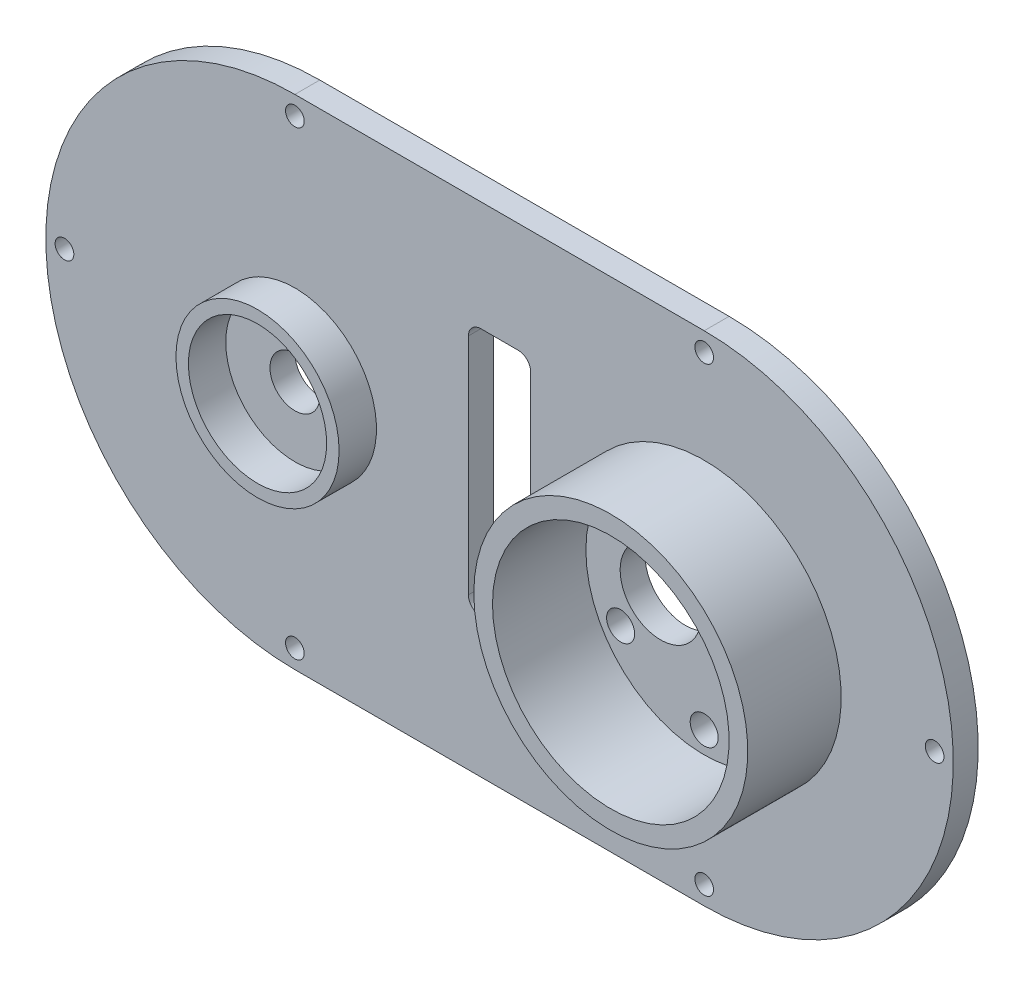
ISO-10303-21;
HEADER;
FILE_DESCRIPTION(('STEP AP214'),'2;1');
FILE_NAME('part.step','',(''),(''),'','','');
FILE_SCHEMA(('AUTOMOTIVE_DESIGN { 1 0 10303 214 1 1 1 1 }'));
ENDSEC;
DATA;
#1=APPLICATION_CONTEXT('core data for automotive mechanical design processes');
#2=APPLICATION_PROTOCOL_DEFINITION('international standard','automotive_design',2000,#1);
#3=PRODUCT_CONTEXT('',#1,'mechanical');
#4=PRODUCT('Part','Part','',(#3));
#5=PRODUCT_RELATED_PRODUCT_CATEGORY('part','',(#4));
#6=PRODUCT_DEFINITION_FORMATION('','',#4);
#7=PRODUCT_DEFINITION_CONTEXT('part definition',#1,'design');
#8=PRODUCT_DEFINITION('design','',#6,#7);
#9=PRODUCT_DEFINITION_SHAPE('','',#8);
#10=(LENGTH_UNIT() NAMED_UNIT(*) SI_UNIT(.MILLI.,.METRE.));
#11=(NAMED_UNIT(*) PLANE_ANGLE_UNIT() SI_UNIT($,.RADIAN.));
#12=(NAMED_UNIT(*) SI_UNIT($,.STERADIAN.) SOLID_ANGLE_UNIT());
#13=UNCERTAINTY_MEASURE_WITH_UNIT(LENGTH_MEASURE(1.E-05),#10,'distance_accuracy_value','');
#14=(GEOMETRIC_REPRESENTATION_CONTEXT(3) GLOBAL_UNCERTAINTY_ASSIGNED_CONTEXT((#13)) GLOBAL_UNIT_ASSIGNED_CONTEXT((#10,
#11,#12)) REPRESENTATION_CONTEXT('',''));
#15=CARTESIAN_POINT('',(0.,0.,0.));
#16=DIRECTION('',(0.,0.,1.));
#17=DIRECTION('',(1.,0.,0.));
#18=AXIS2_PLACEMENT_3D('',#15,#16,#17);
#19=CARTESIAN_POINT('',(-14.334769335642,-2.34767299496333,4.));
#20=DIRECTION('',(0.,0.,-1.));
#21=DIRECTION('',(-1.,0.,0.));
#22=AXIS2_PLACEMENT_3D('',#19,#20,#21);
#23=PLANE('',#22);
#24=CARTESIAN_POINT('',(-14.334769335642,-2.34767299496333,4.));
#25=DIRECTION('',(0.,0.,1.));
#26=DIRECTION('',(-1.,0.,0.));
#27=AXIS2_PLACEMENT_3D('',#24,#25,#26);
#28=CIRCLE('',#27,40.);
#29=CARTESIAN_POINT('',(-14.334769335642,37.6523270050367,4.));
#30=VERTEX_POINT('',#29);
#31=CARTESIAN_POINT('',(-14.334769335642,-42.3476729949633,4.));
#32=VERTEX_POINT('',#31);
#33=EDGE_CURVE('E147',#30,#32,#28,.T.);
#34=ORIENTED_EDGE('',*,*,#33,.T.);
#35=DIRECTION('',(1.,0.,0.));
#36=VECTOR('',#35,1.);
#37=CARTESIAN_POINT('',(51.395230664358,-42.3476729949633,4.));
#38=LINE('',#37,#36);
#39=CARTESIAN_POINT('',(51.395230664358,-42.3476729949633,4.));
#40=VERTEX_POINT('',#39);
#41=EDGE_CURVE('E135',#32,#40,#38,.T.);
#42=ORIENTED_EDGE('',*,*,#41,.T.);
#43=CARTESIAN_POINT('',(51.395230664358,-2.34767299496333,4.));
#44=DIRECTION('',(0.,0.,1.));
#45=DIRECTION('',(-1.,0.,0.));
#46=AXIS2_PLACEMENT_3D('',#43,#44,#45);
#47=CIRCLE('',#46,40.);
#48=CARTESIAN_POINT('',(51.395230664358,37.6523270050367,4.));
#49=VERTEX_POINT('',#48);
#50=EDGE_CURVE('E146',#40,#49,#47,.T.);
#51=ORIENTED_EDGE('',*,*,#50,.T.);
#52=DIRECTION('',(-1.,0.,0.));
#53=VECTOR('',#52,1.);
#54=CARTESIAN_POINT('',(-14.334769335642,37.6523270050367,4.));
#55=LINE('',#54,#53);
#56=EDGE_CURVE('E152',#49,#30,#55,.T.);
#57=ORIENTED_EDGE('',*,*,#56,.T.);
#58=EDGE_LOOP('',(#34,#42,#51,#57));
#59=FACE_BOUND('',#58,.T.);
#60=CARTESIAN_POINT('',(51.395230664358,-2.34767299496308,4.));
#61=DIRECTION('',(0.,0.,-1.));
#62=DIRECTION('',(-1.,0.,0.));
#63=AXIS2_PLACEMENT_3D('',#60,#61,#62);
#64=CIRCLE('',#63,22.);
#65=CARTESIAN_POINT('',(29.395230664358,-2.34767299496308,4.));
#66=VERTEX_POINT('',#65);
#67=EDGE_CURVE('E320',#66,#66,#64,.T.);
#68=ORIENTED_EDGE('',*,*,#67,.T.);
#69=EDGE_LOOP('',(#68));
#70=FACE_BOUND('',#69,.T.);
#71=CARTESIAN_POINT('',(-14.3347693356417,-2.3476729949633,4.));
#72=DIRECTION('',(0.,0.,-1.));
#73=DIRECTION('',(-1.,0.,0.));
#74=AXIS2_PLACEMENT_3D('',#71,#72,#73);
#75=CIRCLE('',#74,13.1);
#76=CARTESIAN_POINT('',(-27.4347693356417,-2.3476729949633,4.));
#77=VERTEX_POINT('',#76);
#78=EDGE_CURVE('E168',#77,#77,#75,.F.);
#79=ORIENTED_EDGE('',*,*,#78,.F.);
#80=EDGE_LOOP('',(#79));
#81=FACE_BOUND('',#80,.T.);
#82=CARTESIAN_POINT('',(51.395230664358,34.6523270050367,4.));
#83=DIRECTION('',(0.,0.,-1.));
#84=DIRECTION('',(-1.,0.,0.));
#85=AXIS2_PLACEMENT_3D('',#82,#83,#84);
#86=CIRCLE('',#85,1.5);
#87=CARTESIAN_POINT('',(49.895230664358,34.6523270050367,4.));
#88=VERTEX_POINT('',#87);
#89=EDGE_CURVE('E277',#88,#88,#86,.F.);
#90=ORIENTED_EDGE('',*,*,#89,.F.);
#91=EDGE_LOOP('',(#90));
#92=FACE_BOUND('',#91,.T.);
#93=CARTESIAN_POINT('',(51.395230664358,-39.3476729949633,4.));
#94=DIRECTION('',(0.,0.,-1.));
#95=DIRECTION('',(-1.,0.,0.));
#96=AXIS2_PLACEMENT_3D('',#93,#94,#95);
#97=CIRCLE('',#96,1.5);
#98=CARTESIAN_POINT('',(49.895230664358,-39.3476729949633,4.));
#99=VERTEX_POINT('',#98);
#100=EDGE_CURVE('E281',#99,#99,#97,.F.);
#101=ORIENTED_EDGE('',*,*,#100,.F.);
#102=EDGE_LOOP('',(#101));
#103=FACE_BOUND('',#102,.T.);
#104=CARTESIAN_POINT('',(-14.334769335642,-39.3476729949633,4.));
#105=DIRECTION('',(0.,0.,-1.));
#106=DIRECTION('',(-1.,0.,0.));
#107=AXIS2_PLACEMENT_3D('',#104,#105,#106);
#108=CIRCLE('',#107,1.5);
#109=CARTESIAN_POINT('',(-15.834769335642,-39.3476729949633,4.));
#110=VERTEX_POINT('',#109);
#111=EDGE_CURVE('E285',#110,#110,#108,.F.);
#112=ORIENTED_EDGE('',*,*,#111,.F.);
#113=EDGE_LOOP('',(#112));
#114=FACE_BOUND('',#113,.T.);
#115=CARTESIAN_POINT('',(-14.334769335642,34.6523270050367,4.));
#116=DIRECTION('',(0.,0.,-1.));
#117=DIRECTION('',(-1.,0.,0.));
#118=AXIS2_PLACEMENT_3D('',#115,#116,#117);
#119=CIRCLE('',#118,1.5);
#120=CARTESIAN_POINT('',(-15.834769335642,34.6523270050367,4.));
#121=VERTEX_POINT('',#120);
#122=EDGE_CURVE('E289',#121,#121,#119,.F.);
#123=ORIENTED_EDGE('',*,*,#122,.F.);
#124=EDGE_LOOP('',(#123));
#125=FACE_BOUND('',#124,.T.);
#126=CARTESIAN_POINT('',(88.395230664358,-2.34767299496333,4.));
#127=DIRECTION('',(0.,0.,-1.));
#128=DIRECTION('',(-1.,0.,0.));
#129=AXIS2_PLACEMENT_3D('',#126,#127,#128);
#130=CIRCLE('',#129,1.5);
#131=CARTESIAN_POINT('',(86.895230664358,-2.34767299496333,4.));
#132=VERTEX_POINT('',#131);
#133=EDGE_CURVE('E293',#132,#132,#130,.F.);
#134=ORIENTED_EDGE('',*,*,#133,.F.);
#135=EDGE_LOOP('',(#134));
#136=FACE_BOUND('',#135,.T.);
#137=CARTESIAN_POINT('',(-51.334769335642,-2.34767299496332,4.));
#138=DIRECTION('',(0.,0.,-1.));
#139=DIRECTION('',(-1.,0.,0.));
#140=AXIS2_PLACEMENT_3D('',#137,#138,#139);
#141=CIRCLE('',#140,1.5);
#142=CARTESIAN_POINT('',(-52.834769335642,-2.34767299496332,4.));
#143=VERTEX_POINT('',#142);
#144=EDGE_CURVE('E297',#143,#143,#141,.F.);
#145=ORIENTED_EDGE('',*,*,#144,.F.);
#146=EDGE_LOOP('',(#145));
#147=FACE_BOUND('',#146,.T.);
#148=DIRECTION('',(0.,1.,0.));
#149=VECTOR('',#148,1.);
#150=CARTESIAN_POINT('',(23.530230664358,-2.34767299496333,4.));
#151=LINE('',#150,#149);
#152=CARTESIAN_POINT('',(23.530230664358,-18.,4.));
#153=VERTEX_POINT('',#152);
#154=CARTESIAN_POINT('',(23.530230664358,18.,4.));
#155=VERTEX_POINT('',#154);
#156=EDGE_CURVE('E243',#153,#155,#151,.T.);
#157=ORIENTED_EDGE('',*,*,#156,.F.);
#158=CARTESIAN_POINT('',(21.530230664358,-18.,4.));
#159=DIRECTION('',(0.,0.,-1.));
#160=DIRECTION('',(-1.,0.,0.));
#161=AXIS2_PLACEMENT_3D('',#158,#159,#160);
#162=CIRCLE('',#161,2.);
#163=CARTESIAN_POINT('',(21.530230664358,-20.,4.));
#164=VERTEX_POINT('',#163);
#165=EDGE_CURVE('E204',#153,#164,#162,.T.);
#166=ORIENTED_EDGE('',*,*,#165,.T.);
#167=DIRECTION('',(1.,0.,0.));
#168=VECTOR('',#167,1.);
#169=CARTESIAN_POINT('',(-14.334769335642,-20.,4.));
#170=LINE('',#169,#168);
#171=CARTESIAN_POINT('',(15.530230664358,-20.,4.));
#172=VERTEX_POINT('',#171);
#173=EDGE_CURVE('E250',#172,#164,#170,.T.);
#174=ORIENTED_EDGE('',*,*,#173,.F.);
#175=CARTESIAN_POINT('',(15.530230664358,-18.,4.));
#176=DIRECTION('',(0.,0.,-1.));
#177=DIRECTION('',(-1.,0.,0.));
#178=AXIS2_PLACEMENT_3D('',#175,#176,#177);
#179=CIRCLE('',#178,2.);
#180=CARTESIAN_POINT('',(13.530230664358,-18.,4.));
#181=VERTEX_POINT('',#180);
#182=EDGE_CURVE('E210',#172,#181,#179,.T.);
#183=ORIENTED_EDGE('',*,*,#182,.T.);
#184=DIRECTION('',(0.,-1.,0.));
#185=VECTOR('',#184,1.);
#186=CARTESIAN_POINT('',(13.530230664358,-2.34767299496333,4.));
#187=LINE('',#186,#185);
#188=CARTESIAN_POINT('',(13.530230664358,18.,4.));
#189=VERTEX_POINT('',#188);
#190=EDGE_CURVE('E238',#189,#181,#187,.T.);
#191=ORIENTED_EDGE('',*,*,#190,.F.);
#192=CARTESIAN_POINT('',(15.530230664358,18.,4.));
#193=DIRECTION('',(0.,0.,-1.));
#194=DIRECTION('',(-1.,0.,0.));
#195=AXIS2_PLACEMENT_3D('',#192,#193,#194);
#196=CIRCLE('',#195,2.);
#197=CARTESIAN_POINT('',(15.530230664358,20.,4.));
#198=VERTEX_POINT('',#197);
#199=EDGE_CURVE('E11',#189,#198,#196,.T.);
#200=ORIENTED_EDGE('',*,*,#199,.T.);
#201=DIRECTION('',(-1.,0.,0.));
#202=VECTOR('',#201,1.);
#203=CARTESIAN_POINT('',(-14.334769335642,20.,4.));
#204=LINE('',#203,#202);
#205=CARTESIAN_POINT('',(21.530230664358,20.,4.));
#206=VERTEX_POINT('',#205);
#207=EDGE_CURVE('E236',#206,#198,#204,.T.);
#208=ORIENTED_EDGE('',*,*,#207,.F.);
#209=CARTESIAN_POINT('',(21.530230664358,18.,4.));
#210=DIRECTION('',(0.,0.,-1.));
#211=DIRECTION('',(-1.,0.,0.));
#212=AXIS2_PLACEMENT_3D('',#209,#210,#211);
#213=CIRCLE('',#212,2.);
#214=EDGE_CURVE('E215',#206,#155,#213,.T.);
#215=ORIENTED_EDGE('',*,*,#214,.T.);
#216=EDGE_LOOP('',(#157,#166,#174,#183,#191,#200,#208,#215));
#217=FACE_BOUND('',#216,.T.);
#218=ADVANCED_FACE('F45',(#59,#70,#81,#92,#103,#114,#125,#136,#147,#217),#23,.F.);
#219=CARTESIAN_POINT('',(-14.334769335642,-2.34767299496333,0.));
#220=DIRECTION('',(0.,0.,-1.));
#221=DIRECTION('',(-1.,0.,0.));
#222=AXIS2_PLACEMENT_3D('',#219,#220,#221);
#223=PLANE('',#222);
#224=CARTESIAN_POINT('',(-51.334769335642,-2.34767299496332,0.));
#225=DIRECTION('',(0.,0.,1.));
#226=DIRECTION('',(1.,0.,0.));
#227=AXIS2_PLACEMENT_3D('',#224,#225,#226);
#228=CIRCLE('',#227,1.5);
#229=CARTESIAN_POINT('',(-49.834769335642,-2.34767299496332,0.));
#230=VERTEX_POINT('',#229);
#231=EDGE_CURVE('E248',#230,#230,#228,.T.);
#232=ORIENTED_EDGE('',*,*,#231,.T.);
#233=EDGE_LOOP('',(#232));
#234=FACE_BOUND('',#233,.T.);
#235=CARTESIAN_POINT('',(88.395230664358,-2.34767299496333,0.));
#236=DIRECTION('',(0.,0.,1.));
#237=DIRECTION('',(1.,0.,0.));
#238=AXIS2_PLACEMENT_3D('',#235,#236,#237);
#239=CIRCLE('',#238,1.5);
#240=CARTESIAN_POINT('',(89.895230664358,-2.34767299496333,0.));
#241=VERTEX_POINT('',#240);
#242=EDGE_CURVE('E267',#241,#241,#239,.T.);
#243=ORIENTED_EDGE('',*,*,#242,.T.);
#244=EDGE_LOOP('',(#243));
#245=FACE_BOUND('',#244,.T.);
#246=CARTESIAN_POINT('',(-14.334769335642,34.6523270050367,0.));
#247=DIRECTION('',(0.,0.,1.));
#248=DIRECTION('',(1.,0.,0.));
#249=AXIS2_PLACEMENT_3D('',#246,#247,#248);
#250=CIRCLE('',#249,1.5);
#251=CARTESIAN_POINT('',(-12.834769335642,34.6523270050367,0.));
#252=VERTEX_POINT('',#251);
#253=EDGE_CURVE('E263',#252,#252,#250,.T.);
#254=ORIENTED_EDGE('',*,*,#253,.T.);
#255=EDGE_LOOP('',(#254));
#256=FACE_BOUND('',#255,.T.);
#257=CARTESIAN_POINT('',(-14.334769335642,-39.3476729949633,0.));
#258=DIRECTION('',(0.,0.,1.));
#259=DIRECTION('',(1.,0.,0.));
#260=AXIS2_PLACEMENT_3D('',#257,#258,#259);
#261=CIRCLE('',#260,1.5);
#262=CARTESIAN_POINT('',(-12.834769335642,-39.3476729949633,0.));
#263=VERTEX_POINT('',#262);
#264=EDGE_CURVE('E259',#263,#263,#261,.T.);
#265=ORIENTED_EDGE('',*,*,#264,.T.);
#266=EDGE_LOOP('',(#265));
#267=FACE_BOUND('',#266,.T.);
#268=CARTESIAN_POINT('',(51.395230664358,-39.3476729949633,0.));
#269=DIRECTION('',(0.,0.,1.));
#270=DIRECTION('',(1.,0.,0.));
#271=AXIS2_PLACEMENT_3D('',#268,#269,#270);
#272=CIRCLE('',#271,1.5);
#273=CARTESIAN_POINT('',(52.895230664358,-39.3476729949633,0.));
#274=VERTEX_POINT('',#273);
#275=EDGE_CURVE('E254',#274,#274,#272,.T.);
#276=ORIENTED_EDGE('',*,*,#275,.T.);
#277=EDGE_LOOP('',(#276));
#278=FACE_BOUND('',#277,.T.);
#279=CARTESIAN_POINT('',(51.395230664358,34.6523270050367,0.));
#280=DIRECTION('',(0.,0.,1.));
#281=DIRECTION('',(1.,0.,0.));
#282=AXIS2_PLACEMENT_3D('',#279,#280,#281);
#283=CIRCLE('',#282,1.5);
#284=CARTESIAN_POINT('',(52.895230664358,34.6523270050367,0.));
#285=VERTEX_POINT('',#284);
#286=EDGE_CURVE('E258',#285,#285,#283,.T.);
#287=ORIENTED_EDGE('',*,*,#286,.T.);
#288=EDGE_LOOP('',(#287));
#289=FACE_BOUND('',#288,.T.);
#290=CARTESIAN_POINT('',(37.9718369056992,5.40232700503671,0.));
#291=DIRECTION('',(0.,0.,-1.));
#292=DIRECTION('',(-1.,0.,0.));
#293=AXIS2_PLACEMENT_3D('',#290,#291,#292);
#294=CIRCLE('',#293,2.25);
#295=CARTESIAN_POINT('',(35.7218369056992,5.40232700503671,0.));
#296=VERTEX_POINT('',#295);
#297=EDGE_CURVE('E371',#296,#296,#294,.T.);
#298=ORIENTED_EDGE('',*,*,#297,.F.);
#299=EDGE_LOOP('',(#298));
#300=FACE_BOUND('',#299,.T.);
#301=CARTESIAN_POINT('',(37.9718369056992,-10.0976729949633,0.));
#302=DIRECTION('',(0.,0.,-1.));
#303=DIRECTION('',(-1.,0.,0.));
#304=AXIS2_PLACEMENT_3D('',#301,#302,#303);
#305=CIRCLE('',#304,2.25);
#306=CARTESIAN_POINT('',(35.7218369056992,-10.0976729949633,0.));
#307=VERTEX_POINT('',#306);
#308=EDGE_CURVE('E363',#307,#307,#305,.T.);
#309=ORIENTED_EDGE('',*,*,#308,.F.);
#310=EDGE_LOOP('',(#309));
#311=FACE_BOUND('',#310,.T.);
#312=CARTESIAN_POINT('',(51.395230664358,-17.8476729949632,0.));
#313=DIRECTION('',(0.,0.,-1.));
#314=DIRECTION('',(-1.,0.,0.));
#315=AXIS2_PLACEMENT_3D('',#312,#313,#314);
#316=CIRCLE('',#315,2.25);
#317=CARTESIAN_POINT('',(49.145230664358,-17.8476729949632,0.));
#318=VERTEX_POINT('',#317);
#319=EDGE_CURVE('E355',#318,#318,#316,.T.);
#320=ORIENTED_EDGE('',*,*,#319,.F.);
#321=EDGE_LOOP('',(#320));
#322=FACE_BOUND('',#321,.T.);
#323=CARTESIAN_POINT('',(64.8186244230169,-10.0976729949631,0.));
#324=DIRECTION('',(0.,0.,-1.));
#325=DIRECTION('',(-1.,0.,0.));
#326=AXIS2_PLACEMENT_3D('',#323,#324,#325);
#327=CIRCLE('',#326,2.25);
#328=CARTESIAN_POINT('',(62.5686244230169,-10.0976729949631,0.));
#329=VERTEX_POINT('',#328);
#330=EDGE_CURVE('E347',#329,#329,#327,.T.);
#331=ORIENTED_EDGE('',*,*,#330,.F.);
#332=EDGE_LOOP('',(#331));
#333=FACE_BOUND('',#332,.T.);
#334=CARTESIAN_POINT('',(64.8186244230167,5.40232700503671,0.));
#335=DIRECTION('',(0.,0.,-1.));
#336=DIRECTION('',(-1.,0.,0.));
#337=AXIS2_PLACEMENT_3D('',#334,#335,#336);
#338=CIRCLE('',#337,2.25);
#339=CARTESIAN_POINT('',(62.5686244230167,5.40232700503671,0.));
#340=VERTEX_POINT('',#339);
#341=EDGE_CURVE('E339',#340,#340,#338,.T.);
#342=ORIENTED_EDGE('',*,*,#341,.F.);
#343=EDGE_LOOP('',(#342));
#344=FACE_BOUND('',#343,.T.);
#345=CARTESIAN_POINT('',(51.395230664358,13.1523270050367,0.));
#346=DIRECTION('',(0.,0.,-1.));
#347=DIRECTION('',(-1.,0.,0.));
#348=AXIS2_PLACEMENT_3D('',#345,#346,#347);
#349=CIRCLE('',#348,2.25);
#350=CARTESIAN_POINT('',(49.145230664358,13.1523270050367,0.));
#351=VERTEX_POINT('',#350);
#352=EDGE_CURVE('E329',#351,#351,#349,.T.);
#353=ORIENTED_EDGE('',*,*,#352,.F.);
#354=EDGE_LOOP('',(#353));
#355=FACE_BOUND('',#354,.T.);
#356=CARTESIAN_POINT('',(44.395230664358,-2.34767299496333,0.));
#357=DIRECTION('',(0.,0.,-1.));
#358=DIRECTION('',(-1.,0.,0.));
#359=AXIS2_PLACEMENT_3D('',#356,#357,#358);
#360=CIRCLE('',#359,6.5);
#361=CARTESIAN_POINT('',(37.895230664358,-2.34767299496333,0.));
#362=VERTEX_POINT('',#361);
#363=EDGE_CURVE('E388',#362,#362,#360,.T.);
#364=ORIENTED_EDGE('',*,*,#363,.F.);
#365=EDGE_LOOP('',(#364));
#366=FACE_BOUND('',#365,.T.);
#367=CARTESIAN_POINT('',(-14.334769335642,-2.34767299496333,0.));
#368=DIRECTION('',(0.,0.,1.));
#369=DIRECTION('',(-1.,0.,0.));
#370=AXIS2_PLACEMENT_3D('',#367,#368,#369);
#371=CIRCLE('',#370,40.);
#372=CARTESIAN_POINT('',(-14.334769335642,37.6523270050367,0.));
#373=VERTEX_POINT('',#372);
#374=CARTESIAN_POINT('',(-14.334769335642,-42.3476729949633,0.));
#375=VERTEX_POINT('',#374);
#376=EDGE_CURVE('E161',#373,#375,#371,.T.);
#377=ORIENTED_EDGE('',*,*,#376,.F.);
#378=DIRECTION('',(-1.,0.,0.));
#379=VECTOR('',#378,1.);
#380=CARTESIAN_POINT('',(-14.334769335642,37.6523270050367,0.));
#381=LINE('',#380,#379);
#382=CARTESIAN_POINT('',(51.395230664358,37.6523270050367,0.));
#383=VERTEX_POINT('',#382);
#384=EDGE_CURVE('E157',#383,#373,#381,.T.);
#385=ORIENTED_EDGE('',*,*,#384,.F.);
#386=CARTESIAN_POINT('',(51.395230664358,-2.34767299496333,0.));
#387=DIRECTION('',(0.,0.,1.));
#388=DIRECTION('',(-1.,0.,0.));
#389=AXIS2_PLACEMENT_3D('',#386,#387,#388);
#390=CIRCLE('',#389,40.);
#391=CARTESIAN_POINT('',(51.395230664358,-42.3476729949633,0.));
#392=VERTEX_POINT('',#391);
#393=EDGE_CURVE('E402',#392,#383,#390,.T.);
#394=ORIENTED_EDGE('',*,*,#393,.F.);
#395=DIRECTION('',(1.,0.,0.));
#396=VECTOR('',#395,1.);
#397=CARTESIAN_POINT('',(51.395230664358,-42.3476729949633,0.));
#398=LINE('',#397,#396);
#399=EDGE_CURVE('E399',#375,#392,#398,.T.);
#400=ORIENTED_EDGE('',*,*,#399,.F.);
#401=EDGE_LOOP('',(#377,#385,#394,#400));
#402=FACE_BOUND('',#401,.T.);
#403=CARTESIAN_POINT('',(-14.3347693356417,-2.3476729949633,0.));
#404=DIRECTION('',(0.,0.,-1.));
#405=DIRECTION('',(-1.,0.,0.));
#406=AXIS2_PLACEMENT_3D('',#403,#404,#405);
#407=CIRCLE('',#406,4.);
#408=CARTESIAN_POINT('',(-18.3347693356417,-2.3476729949633,0.));
#409=VERTEX_POINT('',#408);
#410=EDGE_CURVE('E325',#409,#409,#407,.T.);
#411=ORIENTED_EDGE('',*,*,#410,.F.);
#412=EDGE_LOOP('',(#411));
#413=FACE_BOUND('',#412,.T.);
#414=DIRECTION('',(0.,-1.,0.));
#415=VECTOR('',#414,1.);
#416=CARTESIAN_POINT('',(13.530230664358,-20.,0.));
#417=LINE('',#416,#415);
#418=CARTESIAN_POINT('',(13.530230664358,18.,0.));
#419=VERTEX_POINT('',#418);
#420=CARTESIAN_POINT('',(13.530230664358,-18.,0.));
#421=VERTEX_POINT('',#420);
#422=EDGE_CURVE('E221',#419,#421,#417,.T.);
#423=ORIENTED_EDGE('',*,*,#422,.T.);
#424=CARTESIAN_POINT('',(15.530230664358,-18.,0.));
#425=DIRECTION('',(0.,0.,-1.));
#426=DIRECTION('',(-1.,0.,0.));
#427=AXIS2_PLACEMENT_3D('',#424,#425,#426);
#428=CIRCLE('',#427,2.);
#429=CARTESIAN_POINT('',(15.530230664358,-20.,0.));
#430=VERTEX_POINT('',#429);
#431=EDGE_CURVE('E207',#421,#430,#428,.F.);
#432=ORIENTED_EDGE('',*,*,#431,.T.);
#433=DIRECTION('',(1.,0.,0.));
#434=VECTOR('',#433,1.);
#435=CARTESIAN_POINT('',(13.530230664358,-20.,0.));
#436=LINE('',#435,#434);
#437=CARTESIAN_POINT('',(21.530230664358,-20.,0.));
#438=VERTEX_POINT('',#437);
#439=EDGE_CURVE('E229',#430,#438,#436,.T.);
#440=ORIENTED_EDGE('',*,*,#439,.T.);
#441=CARTESIAN_POINT('',(21.530230664358,-18.,0.));
#442=DIRECTION('',(0.,0.,-1.));
#443=DIRECTION('',(-1.,0.,0.));
#444=AXIS2_PLACEMENT_3D('',#441,#442,#443);
#445=CIRCLE('',#444,2.);
#446=CARTESIAN_POINT('',(23.530230664358,-18.,0.));
#447=VERTEX_POINT('',#446);
#448=EDGE_CURVE('E201',#438,#447,#445,.F.);
#449=ORIENTED_EDGE('',*,*,#448,.T.);
#450=DIRECTION('',(0.,1.,0.));
#451=VECTOR('',#450,1.);
#452=CARTESIAN_POINT('',(23.530230664358,-20.,0.));
#453=LINE('',#452,#451);
#454=CARTESIAN_POINT('',(23.530230664358,18.,0.));
#455=VERTEX_POINT('',#454);
#456=EDGE_CURVE('E753',#447,#455,#453,.T.);
#457=ORIENTED_EDGE('',*,*,#456,.T.);
#458=CARTESIAN_POINT('',(21.530230664358,18.,0.));
#459=DIRECTION('',(0.,0.,-1.));
#460=DIRECTION('',(-1.,0.,0.));
#461=AXIS2_PLACEMENT_3D('',#458,#459,#460);
#462=CIRCLE('',#461,2.);
#463=CARTESIAN_POINT('',(21.530230664358,20.,0.));
#464=VERTEX_POINT('',#463);
#465=EDGE_CURVE('E68',#455,#464,#462,.F.);
#466=ORIENTED_EDGE('',*,*,#465,.T.);
#467=DIRECTION('',(-1.,0.,0.));
#468=VECTOR('',#467,1.);
#469=CARTESIAN_POINT('',(13.530230664358,20.,0.));
#470=LINE('',#469,#468);
#471=CARTESIAN_POINT('',(15.530230664358,20.,0.));
#472=VERTEX_POINT('',#471);
#473=EDGE_CURVE('E222',#464,#472,#470,.T.);
#474=ORIENTED_EDGE('',*,*,#473,.T.);
#475=CARTESIAN_POINT('',(15.530230664358,18.,0.));
#476=DIRECTION('',(0.,0.,-1.));
#477=DIRECTION('',(-1.,0.,0.));
#478=AXIS2_PLACEMENT_3D('',#475,#476,#477);
#479=CIRCLE('',#478,2.);
#480=EDGE_CURVE('E54',#472,#419,#479,.F.);
#481=ORIENTED_EDGE('',*,*,#480,.T.);
#482=EDGE_LOOP('',(#423,#432,#440,#449,#457,#466,#474,#481));
#483=FACE_BOUND('',#482,.T.);
#484=ADVANCED_FACE('F220',(#234,#245,#256,#267,#278,#289,#300,#311,#322,#333,#344,#355,#366,
#402,#413,#483),#223,.T.);
#485=CARTESIAN_POINT('',(-14.3347693356417,-2.3476729949633,4.));
#486=DIRECTION('',(0.,0.,-1.));
#487=DIRECTION('',(-1.,0.,0.));
#488=AXIS2_PLACEMENT_3D('',#485,#486,#487);
#489=CIRCLE('',#488,4.);
#490=CARTESIAN_POINT('',(-18.3347693356417,-2.3476729949633,4.));
#491=VERTEX_POINT('',#490);
#492=EDGE_CURVE('E375',#491,#491,#489,.T.);
#493=ORIENTED_EDGE('',*,*,#492,.T.);
#494=EDGE_LOOP('',(#493));
#495=FACE_BOUND('',#494,.T.);
#496=CARTESIAN_POINT('',(-14.3347693356417,-2.3476729949633,4.));
#497=DIRECTION('',(0.,0.,-1.));
#498=DIRECTION('',(-1.,0.,0.));
#499=AXIS2_PLACEMENT_3D('',#496,#497,#498);
#500=CIRCLE('',#499,11.1);
#501=CARTESIAN_POINT('',(-25.4347693356417,-2.3476729949633,4.));
#502=VERTEX_POINT('',#501);
#503=EDGE_CURVE('E309',#502,#502,#500,.F.);
#504=ORIENTED_EDGE('',*,*,#503,.T.);
#505=EDGE_LOOP('',(#504));
#506=FACE_BOUND('',#505,.T.);
#507=ADVANCED_FACE('F430',(#495,#506),#23,.F.);
#508=CARTESIAN_POINT('',(44.395230664358,-2.34767299496333,4.));
#509=DIRECTION('',(0.,0.,-1.));
#510=DIRECTION('',(-1.,0.,0.));
#511=AXIS2_PLACEMENT_3D('',#508,#509,#510);
#512=CIRCLE('',#511,6.5);
#513=CARTESIAN_POINT('',(37.895230664358,-2.34767299496333,4.));
#514=VERTEX_POINT('',#513);
#515=EDGE_CURVE('E338',#514,#514,#512,.T.);
#516=ORIENTED_EDGE('',*,*,#515,.T.);
#517=EDGE_LOOP('',(#516));
#518=FACE_BOUND('',#517,.T.);
#519=CARTESIAN_POINT('',(51.395230664358,13.1523270050367,4.));
#520=DIRECTION('',(0.,0.,-1.));
#521=DIRECTION('',(-1.,0.,0.));
#522=AXIS2_PLACEMENT_3D('',#519,#520,#521);
#523=CIRCLE('',#522,2.25);
#524=CARTESIAN_POINT('',(49.145230664358,13.1523270050367,4.));
#525=VERTEX_POINT('',#524);
#526=EDGE_CURVE('E333',#525,#525,#523,.T.);
#527=ORIENTED_EDGE('',*,*,#526,.T.);
#528=EDGE_LOOP('',(#527));
#529=FACE_BOUND('',#528,.T.);
#530=CARTESIAN_POINT('',(64.8186244230167,5.40232700503671,4.));
#531=DIRECTION('',(0.,0.,-1.));
#532=DIRECTION('',(-1.,0.,0.));
#533=AXIS2_PLACEMENT_3D('',#530,#531,#532);
#534=CIRCLE('',#533,2.25);
#535=CARTESIAN_POINT('',(62.5686244230167,5.40232700503671,4.));
#536=VERTEX_POINT('',#535);
#537=EDGE_CURVE('E334',#536,#536,#534,.T.);
#538=ORIENTED_EDGE('',*,*,#537,.T.);
#539=EDGE_LOOP('',(#538));
#540=FACE_BOUND('',#539,.T.);
#541=CARTESIAN_POINT('',(64.8186244230169,-10.0976729949631,4.));
#542=DIRECTION('',(0.,0.,-1.));
#543=DIRECTION('',(-1.,0.,0.));
#544=AXIS2_PLACEMENT_3D('',#541,#542,#543);
#545=CIRCLE('',#544,2.25);
#546=CARTESIAN_POINT('',(62.5686244230169,-10.0976729949631,4.));
#547=VERTEX_POINT('',#546);
#548=EDGE_CURVE('E343',#547,#547,#545,.T.);
#549=ORIENTED_EDGE('',*,*,#548,.T.);
#550=EDGE_LOOP('',(#549));
#551=FACE_BOUND('',#550,.T.);
#552=CARTESIAN_POINT('',(51.395230664358,-17.8476729949632,4.));
#553=DIRECTION('',(0.,0.,-1.));
#554=DIRECTION('',(-1.,0.,0.));
#555=AXIS2_PLACEMENT_3D('',#552,#553,#554);
#556=CIRCLE('',#555,2.25);
#557=CARTESIAN_POINT('',(49.145230664358,-17.8476729949632,4.));
#558=VERTEX_POINT('',#557);
#559=EDGE_CURVE('E351',#558,#558,#556,.T.);
#560=ORIENTED_EDGE('',*,*,#559,.T.);
#561=EDGE_LOOP('',(#560));
#562=FACE_BOUND('',#561,.T.);
#563=CARTESIAN_POINT('',(37.9718369056992,-10.0976729949633,4.));
#564=DIRECTION('',(0.,0.,-1.));
#565=DIRECTION('',(-1.,0.,0.));
#566=AXIS2_PLACEMENT_3D('',#563,#564,#565);
#567=CIRCLE('',#566,2.25);
#568=CARTESIAN_POINT('',(35.7218369056992,-10.0976729949633,4.));
#569=VERTEX_POINT('',#568);
#570=EDGE_CURVE('E359',#569,#569,#567,.T.);
#571=ORIENTED_EDGE('',*,*,#570,.T.);
#572=EDGE_LOOP('',(#571));
#573=FACE_BOUND('',#572,.T.);
#574=CARTESIAN_POINT('',(37.9718369056992,5.40232700503671,4.));
#575=DIRECTION('',(0.,0.,-1.));
#576=DIRECTION('',(-1.,0.,0.));
#577=AXIS2_PLACEMENT_3D('',#574,#575,#576);
#578=CIRCLE('',#577,2.25);
#579=CARTESIAN_POINT('',(35.7218369056992,5.40232700503671,4.));
#580=VERTEX_POINT('',#579);
#581=EDGE_CURVE('E367',#580,#580,#578,.T.);
#582=ORIENTED_EDGE('',*,*,#581,.T.);
#583=EDGE_LOOP('',(#582));
#584=FACE_BOUND('',#583,.T.);
#585=CARTESIAN_POINT('',(51.395230664358,-2.34767299496308,4.));
#586=DIRECTION('',(0.,0.,-1.));
#587=DIRECTION('',(-1.,0.,0.));
#588=AXIS2_PLACEMENT_3D('',#585,#586,#587);
#589=CIRCLE('',#588,19.);
#590=CARTESIAN_POINT('',(32.395230664358,-2.34767299496308,4.));
#591=VERTEX_POINT('',#590);
#592=EDGE_CURVE('E163',#591,#591,#589,.T.);
#593=ORIENTED_EDGE('',*,*,#592,.F.);
#594=EDGE_LOOP('',(#593));
#595=FACE_BOUND('',#594,.T.);
#596=ADVANCED_FACE('F431',(#518,#529,#540,#551,#562,#573,#584,#595),#23,.F.);
#597=CARTESIAN_POINT('',(-14.334769335642,-2.34767299496333,4.));
#598=DIRECTION('',(0.,0.,-1.));
#599=DIRECTION('',(-1.,0.,0.));
#600=AXIS2_PLACEMENT_3D('',#597,#598,#599);
#601=CYLINDRICAL_SURFACE('',#600,40.);
#602=ORIENTED_EDGE('',*,*,#376,.T.);
#603=DIRECTION('',(0.,0.,-1.));
#604=VECTOR('',#603,1.);
#605=CARTESIAN_POINT('',(-14.334769335642,-42.3476729949633,4.));
#606=LINE('',#605,#604);
#607=EDGE_CURVE('E139',#32,#375,#606,.T.);
#608=ORIENTED_EDGE('',*,*,#607,.F.);
#609=ORIENTED_EDGE('',*,*,#33,.F.);
#610=DIRECTION('',(0.,0.,-1.));
#611=VECTOR('',#610,1.);
#612=CARTESIAN_POINT('',(-14.334769335642,37.6523270050367,4.));
#613=LINE('',#612,#611);
#614=EDGE_CURVE('E396',#30,#373,#613,.T.);
#615=ORIENTED_EDGE('',*,*,#614,.T.);
#616=EDGE_LOOP('',(#602,#608,#609,#615));
#617=FACE_BOUND('',#616,.T.);
#618=ADVANCED_FACE('F159',(#617),#601,.T.);
#619=CARTESIAN_POINT('',(51.395230664358,-42.3476729949633,4.));
#620=DIRECTION('',(0.,1.,0.));
#621=DIRECTION('',(-1.,0.,0.));
#622=AXIS2_PLACEMENT_3D('',#619,#620,#621);
#623=PLANE('',#622);
#624=ORIENTED_EDGE('',*,*,#399,.T.);
#625=DIRECTION('',(0.,0.,-1.));
#626=VECTOR('',#625,1.);
#627=CARTESIAN_POINT('',(51.395230664358,-42.3476729949633,4.));
#628=LINE('',#627,#626);
#629=EDGE_CURVE('E142',#40,#392,#628,.T.);
#630=ORIENTED_EDGE('',*,*,#629,.F.);
#631=ORIENTED_EDGE('',*,*,#41,.F.);
#632=ORIENTED_EDGE('',*,*,#607,.T.);
#633=EDGE_LOOP('',(#624,#630,#631,#632));
#634=FACE_BOUND('',#633,.T.);
#635=ADVANCED_FACE('F137',(#634),#623,.F.);
#636=CARTESIAN_POINT('',(51.395230664358,-2.34767299496333,4.));
#637=DIRECTION('',(0.,0.,-1.));
#638=DIRECTION('',(-1.,0.,0.));
#639=AXIS2_PLACEMENT_3D('',#636,#637,#638);
#640=CYLINDRICAL_SURFACE('',#639,40.);
#641=ORIENTED_EDGE('',*,*,#393,.T.);
#642=DIRECTION('',(0.,0.,-1.));
#643=VECTOR('',#642,1.);
#644=CARTESIAN_POINT('',(51.395230664358,37.6523270050367,4.));
#645=LINE('',#644,#643);
#646=EDGE_CURVE('E170',#49,#383,#645,.T.);
#647=ORIENTED_EDGE('',*,*,#646,.F.);
#648=ORIENTED_EDGE('',*,*,#50,.F.);
#649=ORIENTED_EDGE('',*,*,#629,.T.);
#650=EDGE_LOOP('',(#641,#647,#648,#649));
#651=FACE_BOUND('',#650,.T.);
#652=ADVANCED_FACE('F418',(#651),#640,.T.);
#653=CARTESIAN_POINT('',(-14.334769335642,37.6523270050367,4.));
#654=DIRECTION('',(0.,-1.,0.));
#655=DIRECTION('',(1.,0.,0.));
#656=AXIS2_PLACEMENT_3D('',#653,#654,#655);
#657=PLANE('',#656);
#658=ORIENTED_EDGE('',*,*,#384,.T.);
#659=ORIENTED_EDGE('',*,*,#614,.F.);
#660=ORIENTED_EDGE('',*,*,#56,.F.);
#661=ORIENTED_EDGE('',*,*,#646,.T.);
#662=EDGE_LOOP('',(#658,#659,#660,#661));
#663=FACE_BOUND('',#662,.T.);
#664=ADVANCED_FACE('F413',(#663),#657,.F.);
#665=CARTESIAN_POINT('',(44.395230664358,-2.34767299496333,-18.3847763108502));
#666=DIRECTION('',(0.,0.,1.));
#667=DIRECTION('',(1.,0.,0.));
#668=AXIS2_PLACEMENT_3D('',#665,#666,#667);
#669=CYLINDRICAL_SURFACE('',#668,6.5);
#670=ORIENTED_EDGE('',*,*,#515,.F.);
#671=EDGE_LOOP('',(#670));
#672=FACE_BOUND('',#671,.T.);
#673=ORIENTED_EDGE('',*,*,#363,.T.);
#674=EDGE_LOOP('',(#673));
#675=FACE_BOUND('',#674,.T.);
#676=ADVANCED_FACE('F425',(#672,#675),#669,.F.);
#677=CARTESIAN_POINT('',(51.395230664358,13.1523270050367,-18.3847763108502));
#678=DIRECTION('',(0.,0.,1.));
#679=DIRECTION('',(1.,0.,0.));
#680=AXIS2_PLACEMENT_3D('',#677,#678,#679);
#681=CYLINDRICAL_SURFACE('',#680,2.25);
#682=ORIENTED_EDGE('',*,*,#526,.F.);
#683=EDGE_LOOP('',(#682));
#684=FACE_BOUND('',#683,.T.);
#685=ORIENTED_EDGE('',*,*,#352,.T.);
#686=EDGE_LOOP('',(#685));
#687=FACE_BOUND('',#686,.T.);
#688=ADVANCED_FACE('F487',(#684,#687),#681,.F.);
#689=CARTESIAN_POINT('',(64.8186244230167,5.40232700503671,-18.3847763108502));
#690=DIRECTION('',(0.,0.,1.));
#691=DIRECTION('',(1.,0.,0.));
#692=AXIS2_PLACEMENT_3D('',#689,#690,#691);
#693=CYLINDRICAL_SURFACE('',#692,2.25);
#694=ORIENTED_EDGE('',*,*,#537,.F.);
#695=EDGE_LOOP('',(#694));
#696=FACE_BOUND('',#695,.T.);
#697=ORIENTED_EDGE('',*,*,#341,.T.);
#698=EDGE_LOOP('',(#697));
#699=FACE_BOUND('',#698,.T.);
#700=ADVANCED_FACE('F490',(#696,#699),#693,.F.);
#701=CARTESIAN_POINT('',(64.8186244230169,-10.0976729949631,-18.3847763108502));
#702=DIRECTION('',(0.,0.,1.));
#703=DIRECTION('',(1.,0.,0.));
#704=AXIS2_PLACEMENT_3D('',#701,#702,#703);
#705=CYLINDRICAL_SURFACE('',#704,2.25);
#706=ORIENTED_EDGE('',*,*,#548,.F.);
#707=EDGE_LOOP('',(#706));
#708=FACE_BOUND('',#707,.T.);
#709=ORIENTED_EDGE('',*,*,#330,.T.);
#710=EDGE_LOOP('',(#709));
#711=FACE_BOUND('',#710,.T.);
#712=ADVANCED_FACE('F494',(#708,#711),#705,.F.);
#713=CARTESIAN_POINT('',(51.395230664358,-17.8476729949632,-18.3847763108502));
#714=DIRECTION('',(0.,0.,1.));
#715=DIRECTION('',(1.,0.,0.));
#716=AXIS2_PLACEMENT_3D('',#713,#714,#715);
#717=CYLINDRICAL_SURFACE('',#716,2.25);
#718=ORIENTED_EDGE('',*,*,#559,.F.);
#719=EDGE_LOOP('',(#718));
#720=FACE_BOUND('',#719,.T.);
#721=ORIENTED_EDGE('',*,*,#319,.T.);
#722=EDGE_LOOP('',(#721));
#723=FACE_BOUND('',#722,.T.);
#724=ADVANCED_FACE('F498',(#720,#723),#717,.F.);
#725=CARTESIAN_POINT('',(37.9718369056992,-10.0976729949633,-18.3847763108502));
#726=DIRECTION('',(0.,0.,1.));
#727=DIRECTION('',(1.,0.,0.));
#728=AXIS2_PLACEMENT_3D('',#725,#726,#727);
#729=CYLINDRICAL_SURFACE('',#728,2.25);
#730=ORIENTED_EDGE('',*,*,#570,.F.);
#731=EDGE_LOOP('',(#730));
#732=FACE_BOUND('',#731,.T.);
#733=ORIENTED_EDGE('',*,*,#308,.T.);
#734=EDGE_LOOP('',(#733));
#735=FACE_BOUND('',#734,.T.);
#736=ADVANCED_FACE('F502',(#732,#735),#729,.F.);
#737=CARTESIAN_POINT('',(37.9718369056992,5.40232700503671,-18.3847763108502));
#738=DIRECTION('',(0.,0.,1.));
#739=DIRECTION('',(1.,0.,0.));
#740=AXIS2_PLACEMENT_3D('',#737,#738,#739);
#741=CYLINDRICAL_SURFACE('',#740,2.25);
#742=ORIENTED_EDGE('',*,*,#581,.F.);
#743=EDGE_LOOP('',(#742));
#744=FACE_BOUND('',#743,.T.);
#745=ORIENTED_EDGE('',*,*,#297,.T.);
#746=EDGE_LOOP('',(#745));
#747=FACE_BOUND('',#746,.T.);
#748=ADVANCED_FACE('F506',(#744,#747),#741,.F.);
#749=CARTESIAN_POINT('',(-14.3347693356417,-2.3476729949633,-18.3847763108502));
#750=DIRECTION('',(0.,0.,1.));
#751=DIRECTION('',(1.,0.,0.));
#752=AXIS2_PLACEMENT_3D('',#749,#750,#751);
#753=CYLINDRICAL_SURFACE('',#752,4.);
#754=ORIENTED_EDGE('',*,*,#492,.F.);
#755=EDGE_LOOP('',(#754));
#756=FACE_BOUND('',#755,.T.);
#757=ORIENTED_EDGE('',*,*,#410,.T.);
#758=EDGE_LOOP('',(#757));
#759=FACE_BOUND('',#758,.T.);
#760=ADVANCED_FACE('F485',(#756,#759),#753,.F.);
#761=CARTESIAN_POINT('',(51.395230664358,-2.34767299496308,19.));
#762=DIRECTION('',(0.,0.,-1.));
#763=DIRECTION('',(-1.,0.,0.));
#764=AXIS2_PLACEMENT_3D('',#761,#762,#763);
#765=CYLINDRICAL_SURFACE('',#764,22.);
#766=CARTESIAN_POINT('',(51.395230664358,-2.34767299496308,19.));
#767=DIRECTION('',(0.,0.,-1.));
#768=DIRECTION('',(-1.,0.,0.));
#769=AXIS2_PLACEMENT_3D('',#766,#767,#768);
#770=CIRCLE('',#769,22.);
#771=CARTESIAN_POINT('',(29.395230664358,-2.34767299496308,19.));
#772=VERTEX_POINT('',#771);
#773=EDGE_CURVE('E321',#772,#772,#770,.T.);
#774=ORIENTED_EDGE('',*,*,#773,.T.);
#775=EDGE_LOOP('',(#774));
#776=FACE_BOUND('',#775,.T.);
#777=ORIENTED_EDGE('',*,*,#67,.F.);
#778=EDGE_LOOP('',(#777));
#779=FACE_BOUND('',#778,.T.);
#780=ADVANCED_FACE('F478',(#776,#779),#765,.T.);
#781=CARTESIAN_POINT('',(51.395230664358,-2.34767299496308,19.));
#782=DIRECTION('',(0.,0.,-1.));
#783=DIRECTION('',(-1.,0.,0.));
#784=AXIS2_PLACEMENT_3D('',#781,#782,#783);
#785=PLANE('',#784);
#786=CARTESIAN_POINT('',(51.395230664358,-2.34767299496308,19.));
#787=DIRECTION('',(0.,0.,-1.));
#788=DIRECTION('',(-1.,0.,0.));
#789=AXIS2_PLACEMENT_3D('',#786,#787,#788);
#790=CIRCLE('',#789,19.);
#791=CARTESIAN_POINT('',(32.395230664358,-2.34767299496308,19.));
#792=VERTEX_POINT('',#791);
#793=EDGE_CURVE('E313',#792,#792,#790,.T.);
#794=ORIENTED_EDGE('',*,*,#793,.T.);
#795=EDGE_LOOP('',(#794));
#796=FACE_BOUND('',#795,.T.);
#797=ORIENTED_EDGE('',*,*,#773,.F.);
#798=EDGE_LOOP('',(#797));
#799=FACE_BOUND('',#798,.T.);
#800=ADVANCED_FACE('F468',(#796,#799),#785,.F.);
#801=CARTESIAN_POINT('',(51.395230664358,-2.34767299496308,19.));
#802=DIRECTION('',(0.,0.,-1.));
#803=DIRECTION('',(-1.,0.,0.));
#804=AXIS2_PLACEMENT_3D('',#801,#802,#803);
#805=CYLINDRICAL_SURFACE('',#804,19.);
#806=ORIENTED_EDGE('',*,*,#793,.F.);
#807=EDGE_LOOP('',(#806));
#808=FACE_BOUND('',#807,.T.);
#809=ORIENTED_EDGE('',*,*,#592,.T.);
#810=EDGE_LOOP('',(#809));
#811=FACE_BOUND('',#810,.T.);
#812=ADVANCED_FACE('F465',(#808,#811),#805,.F.);
#813=CARTESIAN_POINT('',(-14.3347693356417,-2.3476729949633,10.));
#814=DIRECTION('',(0.,0.,-1.));
#815=DIRECTION('',(-1.,0.,0.));
#816=AXIS2_PLACEMENT_3D('',#813,#814,#815);
#817=CYLINDRICAL_SURFACE('',#816,13.1);
#818=CARTESIAN_POINT('',(-14.3347693356417,-2.3476729949633,10.));
#819=DIRECTION('',(0.,0.,1.));
#820=DIRECTION('',(1.,0.,0.));
#821=AXIS2_PLACEMENT_3D('',#818,#819,#820);
#822=CIRCLE('',#821,13.1);
#823=CARTESIAN_POINT('',(-1.23476933564174,-2.3476729949633,10.));
#824=VERTEX_POINT('',#823);
#825=EDGE_CURVE('E305',#824,#824,#822,.T.);
#826=ORIENTED_EDGE('',*,*,#825,.F.);
#827=EDGE_LOOP('',(#826));
#828=FACE_BOUND('',#827,.T.);
#829=ORIENTED_EDGE('',*,*,#78,.T.);
#830=EDGE_LOOP('',(#829));
#831=FACE_BOUND('',#830,.T.);
#832=ADVANCED_FACE('F467',(#828,#831),#817,.T.);
#833=CARTESIAN_POINT('',(-14.3347693356417,-2.3476729949633,10.));
#834=DIRECTION('',(0.,0.,-1.));
#835=DIRECTION('',(-1.,0.,0.));
#836=AXIS2_PLACEMENT_3D('',#833,#834,#835);
#837=CYLINDRICAL_SURFACE('',#836,11.1);
#838=CARTESIAN_POINT('',(-14.3347693356417,-2.3476729949633,10.));
#839=DIRECTION('',(0.,0.,1.));
#840=DIRECTION('',(1.,0.,0.));
#841=AXIS2_PLACEMENT_3D('',#838,#839,#840);
#842=CIRCLE('',#841,11.1);
#843=CARTESIAN_POINT('',(-3.23476933564174,-2.3476729949633,10.));
#844=VERTEX_POINT('',#843);
#845=EDGE_CURVE('E301',#844,#844,#842,.T.);
#846=ORIENTED_EDGE('',*,*,#845,.T.);
#847=EDGE_LOOP('',(#846));
#848=FACE_BOUND('',#847,.T.);
#849=ORIENTED_EDGE('',*,*,#503,.F.);
#850=EDGE_LOOP('',(#849));
#851=FACE_BOUND('',#850,.T.);
#852=ADVANCED_FACE('F475',(#848,#851),#837,.F.);
#853=CARTESIAN_POINT('',(-14.3347693356417,-2.3476729949633,10.));
#854=DIRECTION('',(0.,0.,1.));
#855=DIRECTION('',(1.,0.,0.));
#856=AXIS2_PLACEMENT_3D('',#853,#854,#855);
#857=PLANE('',#856);
#858=ORIENTED_EDGE('',*,*,#825,.T.);
#859=EDGE_LOOP('',(#858));
#860=FACE_BOUND('',#859,.T.);
#861=ORIENTED_EDGE('',*,*,#845,.F.);
#862=EDGE_LOOP('',(#861));
#863=FACE_BOUND('',#862,.T.);
#864=ADVANCED_FACE('F597',(#860,#863),#857,.T.);
#865=CARTESIAN_POINT('',(51.395230664358,34.6523270050367,19.));
#866=DIRECTION('',(0.,0.,-1.));
#867=DIRECTION('',(-1.,0.,0.));
#868=AXIS2_PLACEMENT_3D('',#865,#866,#867);
#869=CYLINDRICAL_SURFACE('',#868,1.5);
#870=ORIENTED_EDGE('',*,*,#286,.F.);
#871=EDGE_LOOP('',(#870));
#872=FACE_BOUND('',#871,.T.);
#873=ORIENTED_EDGE('',*,*,#89,.T.);
#874=EDGE_LOOP('',(#873));
#875=FACE_BOUND('',#874,.T.);
#876=ADVANCED_FACE('F607',(#872,#875),#869,.F.);
#877=CARTESIAN_POINT('',(51.395230664358,-39.3476729949633,19.));
#878=DIRECTION('',(0.,0.,-1.));
#879=DIRECTION('',(-1.,0.,0.));
#880=AXIS2_PLACEMENT_3D('',#877,#878,#879);
#881=CYLINDRICAL_SURFACE('',#880,1.5);
#882=ORIENTED_EDGE('',*,*,#275,.F.);
#883=EDGE_LOOP('',(#882));
#884=FACE_BOUND('',#883,.T.);
#885=ORIENTED_EDGE('',*,*,#100,.T.);
#886=EDGE_LOOP('',(#885));
#887=FACE_BOUND('',#886,.T.);
#888=ADVANCED_FACE('F616',(#884,#887),#881,.F.);
#889=CARTESIAN_POINT('',(-14.334769335642,-39.3476729949633,19.));
#890=DIRECTION('',(0.,0.,-1.));
#891=DIRECTION('',(-1.,0.,0.));
#892=AXIS2_PLACEMENT_3D('',#889,#890,#891);
#893=CYLINDRICAL_SURFACE('',#892,1.5);
#894=ORIENTED_EDGE('',*,*,#264,.F.);
#895=EDGE_LOOP('',(#894));
#896=FACE_BOUND('',#895,.T.);
#897=ORIENTED_EDGE('',*,*,#111,.T.);
#898=EDGE_LOOP('',(#897));
#899=FACE_BOUND('',#898,.T.);
#900=ADVANCED_FACE('F626',(#896,#899),#893,.F.);
#901=CARTESIAN_POINT('',(-14.334769335642,34.6523270050367,19.));
#902=DIRECTION('',(0.,0.,-1.));
#903=DIRECTION('',(-1.,0.,0.));
#904=AXIS2_PLACEMENT_3D('',#901,#902,#903);
#905=CYLINDRICAL_SURFACE('',#904,1.5);
#906=ORIENTED_EDGE('',*,*,#253,.F.);
#907=EDGE_LOOP('',(#906));
#908=FACE_BOUND('',#907,.T.);
#909=ORIENTED_EDGE('',*,*,#122,.T.);
#910=EDGE_LOOP('',(#909));
#911=FACE_BOUND('',#910,.T.);
#912=ADVANCED_FACE('F636',(#908,#911),#905,.F.);
#913=CARTESIAN_POINT('',(88.395230664358,-2.34767299496333,19.));
#914=DIRECTION('',(0.,0.,-1.));
#915=DIRECTION('',(-1.,0.,0.));
#916=AXIS2_PLACEMENT_3D('',#913,#914,#915);
#917=CYLINDRICAL_SURFACE('',#916,1.5);
#918=ORIENTED_EDGE('',*,*,#242,.F.);
#919=EDGE_LOOP('',(#918));
#920=FACE_BOUND('',#919,.T.);
#921=ORIENTED_EDGE('',*,*,#133,.T.);
#922=EDGE_LOOP('',(#921));
#923=FACE_BOUND('',#922,.T.);
#924=ADVANCED_FACE('F646',(#920,#923),#917,.F.);
#925=CARTESIAN_POINT('',(-51.334769335642,-2.34767299496332,19.));
#926=DIRECTION('',(0.,0.,-1.));
#927=DIRECTION('',(-1.,0.,0.));
#928=AXIS2_PLACEMENT_3D('',#925,#926,#927);
#929=CYLINDRICAL_SURFACE('',#928,1.5);
#930=ORIENTED_EDGE('',*,*,#231,.F.);
#931=EDGE_LOOP('',(#930));
#932=FACE_BOUND('',#931,.T.);
#933=ORIENTED_EDGE('',*,*,#144,.T.);
#934=EDGE_LOOP('',(#933));
#935=FACE_BOUND('',#934,.T.);
#936=ADVANCED_FACE('F656',(#932,#935),#929,.F.);
#937=CARTESIAN_POINT('',(23.530230664358,-20.,19.));
#938=DIRECTION('',(-1.,0.,0.));
#939=DIRECTION('',(0.,0.,1.));
#940=AXIS2_PLACEMENT_3D('',#937,#938,#939);
#941=PLANE('',#940);
#942=ORIENTED_EDGE('',*,*,#456,.F.);
#943=DIRECTION('',(0.,0.,-1.));
#944=VECTOR('',#943,1.);
#945=CARTESIAN_POINT('',(23.530230664358,-18.,4.));
#946=LINE('',#945,#944);
#947=EDGE_CURVE('E185',#447,#153,#946,.F.);
#948=ORIENTED_EDGE('',*,*,#947,.T.);
#949=ORIENTED_EDGE('',*,*,#156,.T.);
#950=DIRECTION('',(0.,0.,-1.));
#951=VECTOR('',#950,1.);
#952=CARTESIAN_POINT('',(23.530230664358,18.,0.));
#953=LINE('',#952,#951);
#954=EDGE_CURVE('E181',#155,#455,#953,.T.);
#955=ORIENTED_EDGE('',*,*,#954,.T.);
#956=EDGE_LOOP('',(#942,#948,#949,#955));
#957=FACE_BOUND('',#956,.T.);
#958=ADVANCED_FACE('F665',(#957),#941,.T.);
#959=CARTESIAN_POINT('',(13.530230664358,20.,19.));
#960=DIRECTION('',(0.,-1.,0.));
#961=DIRECTION('',(0.,0.,-1.));
#962=AXIS2_PLACEMENT_3D('',#959,#960,#961);
#963=PLANE('',#962);
#964=ORIENTED_EDGE('',*,*,#473,.F.);
#965=DIRECTION('',(0.,0.,-1.));
#966=VECTOR('',#965,1.);
#967=CARTESIAN_POINT('',(21.530230664358,20.,4.));
#968=LINE('',#967,#966);
#969=EDGE_CURVE('E198',#464,#206,#968,.F.);
#970=ORIENTED_EDGE('',*,*,#969,.T.);
#971=ORIENTED_EDGE('',*,*,#207,.T.);
#972=DIRECTION('',(0.,0.,-1.));
#973=VECTOR('',#972,1.);
#974=CARTESIAN_POINT('',(15.530230664358,20.,0.));
#975=LINE('',#974,#973);
#976=EDGE_CURVE('E195',#198,#472,#975,.T.);
#977=ORIENTED_EDGE('',*,*,#976,.T.);
#978=EDGE_LOOP('',(#964,#970,#971,#977));
#979=FACE_BOUND('',#978,.T.);
#980=ADVANCED_FACE('F240',(#979),#963,.T.);
#981=CARTESIAN_POINT('',(13.530230664358,-20.,19.));
#982=DIRECTION('',(1.,0.,0.));
#983=DIRECTION('',(0.,0.,-1.));
#984=AXIS2_PLACEMENT_3D('',#981,#982,#983);
#985=PLANE('',#984);
#986=ORIENTED_EDGE('',*,*,#190,.T.);
#987=DIRECTION('',(0.,0.,-1.));
#988=VECTOR('',#987,1.);
#989=CARTESIAN_POINT('',(13.530230664358,-18.,0.));
#990=LINE('',#989,#988);
#991=EDGE_CURVE('E191',#181,#421,#990,.T.);
#992=ORIENTED_EDGE('',*,*,#991,.T.);
#993=ORIENTED_EDGE('',*,*,#422,.F.);
#994=DIRECTION('',(0.,0.,-1.));
#995=VECTOR('',#994,1.);
#996=CARTESIAN_POINT('',(13.530230664358,18.,4.));
#997=LINE('',#996,#995);
#998=EDGE_CURVE('E188',#419,#189,#997,.F.);
#999=ORIENTED_EDGE('',*,*,#998,.T.);
#1000=EDGE_LOOP('',(#986,#992,#993,#999));
#1001=FACE_BOUND('',#1000,.T.);
#1002=ADVANCED_FACE('F225',(#1001),#985,.T.);
#1003=CARTESIAN_POINT('',(13.530230664358,-20.,19.));
#1004=DIRECTION('',(0.,1.,0.));
#1005=DIRECTION('',(0.,0.,1.));
#1006=AXIS2_PLACEMENT_3D('',#1003,#1004,#1005);
#1007=PLANE('',#1006);
#1008=ORIENTED_EDGE('',*,*,#173,.T.);
#1009=DIRECTION('',(0.,0.,-1.));
#1010=VECTOR('',#1009,1.);
#1011=CARTESIAN_POINT('',(21.530230664358,-20.,0.));
#1012=LINE('',#1011,#1010);
#1013=EDGE_CURVE('E177',#164,#438,#1012,.T.);
#1014=ORIENTED_EDGE('',*,*,#1013,.T.);
#1015=ORIENTED_EDGE('',*,*,#439,.F.);
#1016=DIRECTION('',(0.,0.,-1.));
#1017=VECTOR('',#1016,1.);
#1018=CARTESIAN_POINT('',(15.530230664358,-20.,4.));
#1019=LINE('',#1018,#1017);
#1020=EDGE_CURVE('E174',#430,#172,#1019,.F.);
#1021=ORIENTED_EDGE('',*,*,#1020,.T.);
#1022=EDGE_LOOP('',(#1008,#1014,#1015,#1021));
#1023=FACE_BOUND('',#1022,.T.);
#1024=ADVANCED_FACE('F701',(#1023),#1007,.T.);
#1025=CARTESIAN_POINT('',(21.530230664358,-18.,19.));
#1026=DIRECTION('',(0.,0.,1.));
#1027=DIRECTION('',(1.,0.,0.));
#1028=AXIS2_PLACEMENT_3D('',#1025,#1026,#1027);
#1029=CYLINDRICAL_SURFACE('',#1028,2.);
#1030=ORIENTED_EDGE('',*,*,#165,.F.);
#1031=ORIENTED_EDGE('',*,*,#947,.F.);
#1032=ORIENTED_EDGE('',*,*,#448,.F.);
#1033=ORIENTED_EDGE('',*,*,#1013,.F.);
#1034=EDGE_LOOP('',(#1030,#1031,#1032,#1033));
#1035=FACE_BOUND('',#1034,.T.);
#1036=ADVANCED_FACE('F710',(#1035),#1029,.F.);
#1037=CARTESIAN_POINT('',(15.530230664358,-18.,19.));
#1038=DIRECTION('',(0.,0.,1.));
#1039=DIRECTION('',(1.,0.,0.));
#1040=AXIS2_PLACEMENT_3D('',#1037,#1038,#1039);
#1041=CYLINDRICAL_SURFACE('',#1040,2.);
#1042=ORIENTED_EDGE('',*,*,#182,.F.);
#1043=ORIENTED_EDGE('',*,*,#1020,.F.);
#1044=ORIENTED_EDGE('',*,*,#431,.F.);
#1045=ORIENTED_EDGE('',*,*,#991,.F.);
#1046=EDGE_LOOP('',(#1042,#1043,#1044,#1045));
#1047=FACE_BOUND('',#1046,.T.);
#1048=ADVANCED_FACE('F720',(#1047),#1041,.F.);
#1049=CARTESIAN_POINT('',(21.530230664358,18.,19.));
#1050=DIRECTION('',(0.,0.,1.));
#1051=DIRECTION('',(1.,0.,0.));
#1052=AXIS2_PLACEMENT_3D('',#1049,#1050,#1051);
#1053=CYLINDRICAL_SURFACE('',#1052,2.);
#1054=ORIENTED_EDGE('',*,*,#214,.F.);
#1055=ORIENTED_EDGE('',*,*,#969,.F.);
#1056=ORIENTED_EDGE('',*,*,#465,.F.);
#1057=ORIENTED_EDGE('',*,*,#954,.F.);
#1058=EDGE_LOOP('',(#1054,#1055,#1056,#1057));
#1059=FACE_BOUND('',#1058,.T.);
#1060=ADVANCED_FACE('F730',(#1059),#1053,.F.);
#1061=CARTESIAN_POINT('',(15.530230664358,18.,19.));
#1062=DIRECTION('',(0.,0.,1.));
#1063=DIRECTION('',(1.,0.,0.));
#1064=AXIS2_PLACEMENT_3D('',#1061,#1062,#1063);
#1065=CYLINDRICAL_SURFACE('',#1064,2.);
#1066=ORIENTED_EDGE('',*,*,#199,.F.);
#1067=ORIENTED_EDGE('',*,*,#998,.F.);
#1068=ORIENTED_EDGE('',*,*,#480,.F.);
#1069=ORIENTED_EDGE('',*,*,#976,.F.);
#1070=EDGE_LOOP('',(#1066,#1067,#1068,#1069));
#1071=FACE_BOUND('',#1070,.T.);
#1072=ADVANCED_FACE('F47',(#1071),#1065,.F.);
#1073=CLOSED_SHELL('',(#218,#484,#507,#596,#618,#635,#652,#664,#676,#688,#700,#712,#724,#736,
#748,#760,#780,#800,#812,#832,#852,#864,#876,#888,#900,#912,#924,#936,#958,#980,#1002,#1024,
#1036,#1048,#1060,#1072));
#1074=MANIFOLD_SOLID_BREP('B2',#1073);
#1075=ADVANCED_BREP_SHAPE_REPRESENTATION('',(#18,#1074),#14);
#1076=SHAPE_DEFINITION_REPRESENTATION(#9,#1075);
ENDSEC;
END-ISO-10303-21;
